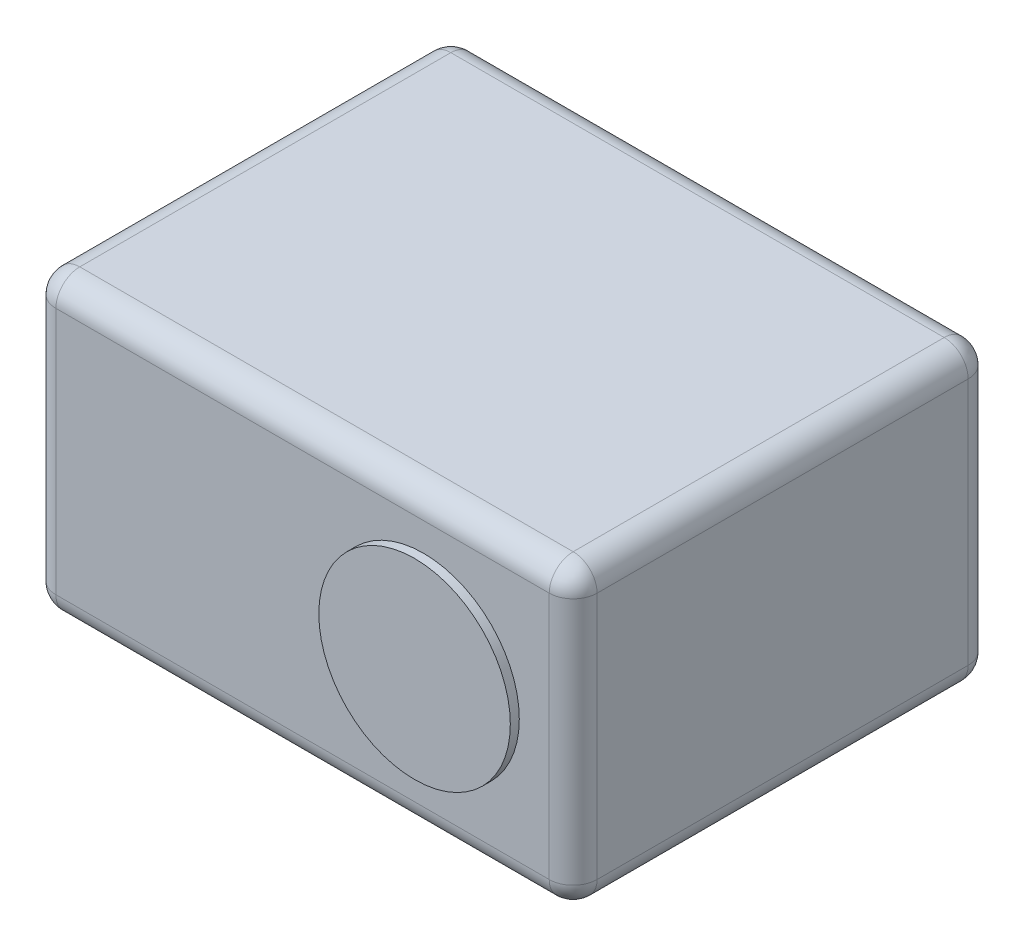
ISO-10303-21;
HEADER;
FILE_DESCRIPTION(('STEP AP214'),'2;1');
FILE_NAME('part.step','',(''),(''),'','','');
FILE_SCHEMA(('AUTOMOTIVE_DESIGN { 1 0 10303 214 1 1 1 1 }'));
ENDSEC;
DATA;
#1=APPLICATION_CONTEXT('core data for automotive mechanical design processes');
#2=APPLICATION_PROTOCOL_DEFINITION('international standard','automotive_design',2000,#1);
#3=PRODUCT_CONTEXT('',#1,'mechanical');
#4=PRODUCT('Part','Part','',(#3));
#5=PRODUCT_RELATED_PRODUCT_CATEGORY('part','',(#4));
#6=PRODUCT_DEFINITION_FORMATION('','',#4);
#7=PRODUCT_DEFINITION_CONTEXT('part definition',#1,'design');
#8=PRODUCT_DEFINITION('design','',#6,#7);
#9=PRODUCT_DEFINITION_SHAPE('','',#8);
#10=(LENGTH_UNIT() NAMED_UNIT(*) SI_UNIT(.MILLI.,.METRE.));
#11=(NAMED_UNIT(*) PLANE_ANGLE_UNIT() SI_UNIT($,.RADIAN.));
#12=(NAMED_UNIT(*) SI_UNIT($,.STERADIAN.) SOLID_ANGLE_UNIT());
#13=UNCERTAINTY_MEASURE_WITH_UNIT(LENGTH_MEASURE(1.E-05),#10,'distance_accuracy_value','');
#14=(GEOMETRIC_REPRESENTATION_CONTEXT(3) GLOBAL_UNCERTAINTY_ASSIGNED_CONTEXT((#13)) GLOBAL_UNIT_ASSIGNED_CONTEXT((#10,
#11,#12)) REPRESENTATION_CONTEXT('',''));
#15=CARTESIAN_POINT('',(0.,0.,0.));
#16=DIRECTION('',(0.,0.,1.));
#17=DIRECTION('',(1.,0.,0.));
#18=AXIS2_PLACEMENT_3D('',#15,#16,#17);
#19=CARTESIAN_POINT('',(0.,0.,18.25));
#20=DIRECTION('',(0.,0.,1.));
#21=DIRECTION('',(1.,0.,0.));
#22=AXIS2_PLACEMENT_3D('',#19,#20,#21);
#23=PLANE('',#22);
#24=CARTESIAN_POINT('',(0.,0.,18.25));
#25=DIRECTION('',(0.,0.,1.));
#26=DIRECTION('',(1.,0.,0.));
#27=AXIS2_PLACEMENT_3D('',#24,#25,#26);
#28=CIRCLE('',#27,8.);
#29=CARTESIAN_POINT('',(8.,0.,18.25));
#30=VERTEX_POINT('',#29);
#31=EDGE_CURVE('E379',#30,#30,#28,.T.);
#32=ORIENTED_EDGE('',*,*,#31,.T.);
#33=EDGE_LOOP('',(#32));
#34=FACE_BOUND('',#33,.T.);
#35=ADVANCED_FACE('F16',(#34),#23,.T.);
#36=CARTESIAN_POINT('',(10.5,10.36,15.5));
#37=DIRECTION('',(0.,-1.,0.));
#38=DIRECTION('',(1.,0.,0.));
#39=AXIS2_PLACEMENT_3D('',#36,#37,#38);
#40=SPHERICAL_SURFACE('',#39,2.);
#41=CARTESIAN_POINT('',(10.5,10.36,15.5));
#42=DIRECTION('',(0.,0.,-1.));
#43=DIRECTION('',(1.,0.,0.));
#44=AXIS2_PLACEMENT_3D('',#41,#42,#43);
#45=CIRCLE('',#44,2.);
#46=CARTESIAN_POINT('',(10.5,12.36,15.5));
#47=VERTEX_POINT('',#46);
#48=CARTESIAN_POINT('',(12.5,10.36,15.5));
#49=VERTEX_POINT('',#48);
#50=EDGE_CURVE('E10',#47,#49,#45,.T.);
#51=ORIENTED_EDGE('',*,*,#50,.F.);
#52=CARTESIAN_POINT('',(10.5,10.36,15.5));
#53=DIRECTION('',(1.,0.,0.));
#54=DIRECTION('',(0.,0.,1.));
#55=AXIS2_PLACEMENT_3D('',#52,#53,#54);
#56=CIRCLE('',#55,2.);
#57=CARTESIAN_POINT('',(10.5,10.36,17.5));
#58=VERTEX_POINT('',#57);
#59=EDGE_CURVE('E243',#47,#58,#56,.T.);
#60=ORIENTED_EDGE('',*,*,#59,.T.);
#61=CARTESIAN_POINT('',(10.5,10.36,15.5));
#62=DIRECTION('',(0.,-1.,0.));
#63=DIRECTION('',(1.,0.,0.));
#64=AXIS2_PLACEMENT_3D('',#61,#62,#63);
#65=CIRCLE('',#64,2.);
#66=EDGE_CURVE('E242',#49,#58,#65,.T.);
#67=ORIENTED_EDGE('',*,*,#66,.F.);
#68=EDGE_LOOP('',(#51,#60,#67));
#69=FACE_BOUND('',#68,.T.);
#70=ADVANCED_FACE('F523',(#69),#40,.T.);
#71=CARTESIAN_POINT('',(0.,0.,-18.25));
#72=DIRECTION('',(0.,0.,1.));
#73=DIRECTION('',(1.,0.,0.));
#74=AXIS2_PLACEMENT_3D('',#71,#72,#73);
#75=PLANE('',#74);
#76=CARTESIAN_POINT('',(0.,0.,-18.25));
#77=DIRECTION('',(0.,0.,1.));
#78=DIRECTION('',(1.,0.,0.));
#79=AXIS2_PLACEMENT_3D('',#76,#77,#78);
#80=CIRCLE('',#79,8.);
#81=CARTESIAN_POINT('',(8.,0.,-18.25));
#82=VERTEX_POINT('',#81);
#83=EDGE_CURVE('E370',#82,#82,#80,.T.);
#84=ORIENTED_EDGE('',*,*,#83,.F.);
#85=EDGE_LOOP('',(#84));
#86=FACE_BOUND('',#85,.T.);
#87=ADVANCED_FACE('F528',(#86),#75,.F.);
#88=CARTESIAN_POINT('',(8.3,9.5,0.));
#89=DIRECTION('',(0.,0.,1.));
#90=DIRECTION('',(1.,0.,0.));
#91=AXIS2_PLACEMENT_3D('',#88,#89,#90);
#92=PLANE('',#91);
#93=CARTESIAN_POINT('',(8.3,9.5,0.));
#94=DIRECTION('',(0.,0.,1.));
#95=DIRECTION('',(1.,0.,0.));
#96=AXIS2_PLACEMENT_3D('',#93,#94,#95);
#97=CIRCLE('',#96,1.1);
#98=CARTESIAN_POINT('',(9.4,9.5,0.));
#99=VERTEX_POINT('',#98);
#100=EDGE_CURVE('E357',#99,#99,#97,.T.);
#101=ORIENTED_EDGE('',*,*,#100,.F.);
#102=EDGE_LOOP('',(#101));
#103=FACE_BOUND('',#102,.T.);
#104=ADVANCED_FACE('F673',(#103),#92,.F.);
#105=CARTESIAN_POINT('',(8.3,-9.5,0.));
#106=DIRECTION('',(0.,0.,1.));
#107=DIRECTION('',(1.,0.,0.));
#108=AXIS2_PLACEMENT_3D('',#105,#106,#107);
#109=PLANE('',#108);
#110=CARTESIAN_POINT('',(8.3,-9.5,0.));
#111=DIRECTION('',(0.,0.,1.));
#112=DIRECTION('',(1.,0.,0.));
#113=AXIS2_PLACEMENT_3D('',#110,#111,#112);
#114=CIRCLE('',#113,1.1);
#115=CARTESIAN_POINT('',(9.4,-9.5,0.));
#116=VERTEX_POINT('',#115);
#117=EDGE_CURVE('E353',#116,#116,#114,.T.);
#118=ORIENTED_EDGE('',*,*,#117,.F.);
#119=EDGE_LOOP('',(#118));
#120=FACE_BOUND('',#119,.T.);
#121=ADVANCED_FACE('F668',(#120),#109,.F.);
#122=CARTESIAN_POINT('',(-28.5,9.5,0.));
#123=DIRECTION('',(0.,0.,1.));
#124=DIRECTION('',(1.,0.,0.));
#125=AXIS2_PLACEMENT_3D('',#122,#123,#124);
#126=PLANE('',#125);
#127=CARTESIAN_POINT('',(-28.5,9.5,0.));
#128=DIRECTION('',(0.,0.,1.));
#129=DIRECTION('',(1.,0.,0.));
#130=AXIS2_PLACEMENT_3D('',#127,#128,#129);
#131=CIRCLE('',#130,1.1);
#132=CARTESIAN_POINT('',(-27.4,9.5,0.));
#133=VERTEX_POINT('',#132);
#134=EDGE_CURVE('E348',#133,#133,#131,.T.);
#135=ORIENTED_EDGE('',*,*,#134,.F.);
#136=EDGE_LOOP('',(#135));
#137=FACE_BOUND('',#136,.T.);
#138=ADVANCED_FACE('F567',(#137),#126,.F.);
#139=CARTESIAN_POINT('',(-28.5,-9.5,0.));
#140=DIRECTION('',(0.,0.,1.));
#141=DIRECTION('',(1.,0.,0.));
#142=AXIS2_PLACEMENT_3D('',#139,#140,#141);
#143=PLANE('',#142);
#144=CARTESIAN_POINT('',(-28.5,-9.5,0.));
#145=DIRECTION('',(0.,0.,1.));
#146=DIRECTION('',(1.,0.,0.));
#147=AXIS2_PLACEMENT_3D('',#144,#145,#146);
#148=CIRCLE('',#147,1.1);
#149=CARTESIAN_POINT('',(-27.4,-9.5,0.));
#150=VERTEX_POINT('',#149);
#151=EDGE_CURVE('E344',#150,#150,#148,.T.);
#152=ORIENTED_EDGE('',*,*,#151,.F.);
#153=EDGE_LOOP('',(#152));
#154=FACE_BOUND('',#153,.T.);
#155=ADVANCED_FACE('F563',(#154),#143,.F.);
#156=CARTESIAN_POINT('',(10.5,10.36,-15.5));
#157=DIRECTION('',(0.,0.,1.));
#158=DIRECTION('',(1.,0.,0.));
#159=AXIS2_PLACEMENT_3D('',#156,#157,#158);
#160=SPHERICAL_SURFACE('',#159,2.);
#161=CARTESIAN_POINT('',(10.5,10.36,-15.5));
#162=DIRECTION('',(0.,-1.,0.));
#163=DIRECTION('',(1.,0.,0.));
#164=AXIS2_PLACEMENT_3D('',#161,#162,#163);
#165=CIRCLE('',#164,2.);
#166=CARTESIAN_POINT('',(10.5,10.36,-17.5));
#167=VERTEX_POINT('',#166);
#168=CARTESIAN_POINT('',(12.5,10.36,-15.5));
#169=VERTEX_POINT('',#168);
#170=EDGE_CURVE('E365',#167,#169,#165,.T.);
#171=ORIENTED_EDGE('',*,*,#170,.F.);
#172=CARTESIAN_POINT('',(10.5,10.36,-15.5));
#173=DIRECTION('',(1.,0.,0.));
#174=DIRECTION('',(0.,1.,0.));
#175=AXIS2_PLACEMENT_3D('',#172,#173,#174);
#176=CIRCLE('',#175,2.);
#177=CARTESIAN_POINT('',(10.5,12.36,-15.5));
#178=VERTEX_POINT('',#177);
#179=EDGE_CURVE('E340',#167,#178,#176,.T.);
#180=ORIENTED_EDGE('',*,*,#179,.T.);
#181=CARTESIAN_POINT('',(10.5,10.36,-15.5));
#182=DIRECTION('',(0.,0.,1.));
#183=DIRECTION('',(1.,0.,0.));
#184=AXIS2_PLACEMENT_3D('',#181,#182,#183);
#185=CIRCLE('',#184,2.);
#186=EDGE_CURVE('E27',#169,#178,#185,.T.);
#187=ORIENTED_EDGE('',*,*,#186,.F.);
#188=EDGE_LOOP('',(#171,#180,#187));
#189=FACE_BOUND('',#188,.T.);
#190=ADVANCED_FACE('F566',(#189),#160,.T.);
#191=CARTESIAN_POINT('',(12.5,-12.36,-17.5));
#192=DIRECTION('',(1.,0.,0.));
#193=DIRECTION('',(0.,1.,0.));
#194=AXIS2_PLACEMENT_3D('',#191,#192,#193);
#195=PLANE('',#194);
#196=DIRECTION('',(0.,0.,1.));
#197=VECTOR('',#196,1.);
#198=CARTESIAN_POINT('',(12.5,-10.36,-17.5));
#199=LINE('',#198,#197);
#200=CARTESIAN_POINT('',(12.5,-10.36,-15.5));
#201=VERTEX_POINT('',#200);
#202=CARTESIAN_POINT('',(12.5,-10.36,15.5));
#203=VERTEX_POINT('',#202);
#204=EDGE_CURVE('E251',#201,#203,#199,.T.);
#205=ORIENTED_EDGE('',*,*,#204,.F.);
#206=DIRECTION('',(0.,1.,0.));
#207=VECTOR('',#206,1.);
#208=CARTESIAN_POINT('',(12.5,-12.36,-15.5));
#209=LINE('',#208,#207);
#210=EDGE_CURVE('E366',#201,#169,#209,.T.);
#211=ORIENTED_EDGE('',*,*,#210,.T.);
#212=DIRECTION('',(0.,0.,1.));
#213=VECTOR('',#212,1.);
#214=CARTESIAN_POINT('',(12.5,10.36,-17.5));
#215=LINE('',#214,#213);
#216=EDGE_CURVE('E295',#169,#49,#215,.T.);
#217=ORIENTED_EDGE('',*,*,#216,.T.);
#218=DIRECTION('',(0.,1.,0.));
#219=VECTOR('',#218,1.);
#220=CARTESIAN_POINT('',(12.5,-12.36,15.5));
#221=LINE('',#220,#219);
#222=EDGE_CURVE('E238',#203,#49,#221,.T.);
#223=ORIENTED_EDGE('',*,*,#222,.F.);
#224=EDGE_LOOP('',(#205,#211,#217,#223));
#225=FACE_BOUND('',#224,.T.);
#226=ADVANCED_FACE('F837',(#225),#195,.T.);
#227=CARTESIAN_POINT('',(10.5,-10.36,15.5));
#228=DIRECTION('',(0.,0.,-1.));
#229=DIRECTION('',(1.,0.,0.));
#230=AXIS2_PLACEMENT_3D('',#227,#228,#229);
#231=SPHERICAL_SURFACE('',#230,2.);
#232=CARTESIAN_POINT('',(10.5,-10.36,15.5));
#233=DIRECTION('',(0.,1.,0.));
#234=DIRECTION('',(1.,0.,0.));
#235=AXIS2_PLACEMENT_3D('',#232,#233,#234);
#236=CIRCLE('',#235,2.);
#237=CARTESIAN_POINT('',(10.5,-10.36,17.5));
#238=VERTEX_POINT('',#237);
#239=EDGE_CURVE('E303',#238,#203,#236,.T.);
#240=ORIENTED_EDGE('',*,*,#239,.F.);
#241=CARTESIAN_POINT('',(10.5,-10.36,15.5));
#242=DIRECTION('',(1.,0.,0.));
#243=DIRECTION('',(0.,-1.,0.));
#244=AXIS2_PLACEMENT_3D('',#241,#242,#243);
#245=CIRCLE('',#244,2.);
#246=CARTESIAN_POINT('',(10.5,-12.36,15.5));
#247=VERTEX_POINT('',#246);
#248=EDGE_CURVE('E176',#238,#247,#245,.T.);
#249=ORIENTED_EDGE('',*,*,#248,.T.);
#250=CARTESIAN_POINT('',(10.5,-10.36,15.5));
#251=DIRECTION('',(0.,0.,-1.));
#252=DIRECTION('',(1.,0.,0.));
#253=AXIS2_PLACEMENT_3D('',#250,#251,#252);
#254=CIRCLE('',#253,2.);
#255=EDGE_CURVE('E252',#203,#247,#254,.T.);
#256=ORIENTED_EDGE('',*,*,#255,.F.);
#257=EDGE_LOOP('',(#240,#249,#256));
#258=FACE_BOUND('',#257,.T.);
#259=ADVANCED_FACE('F827',(#258),#231,.T.);
#260=CARTESIAN_POINT('',(10.5,-10.36,-15.5));
#261=DIRECTION('',(0.,0.,1.));
#262=DIRECTION('',(1.,0.,0.));
#263=AXIS2_PLACEMENT_3D('',#260,#261,#262);
#264=SPHERICAL_SURFACE('',#263,2.);
#265=CARTESIAN_POINT('',(10.5,-10.36,-15.5));
#266=DIRECTION('',(0.,0.,-1.));
#267=DIRECTION('',(1.,0.,0.));
#268=AXIS2_PLACEMENT_3D('',#265,#266,#267);
#269=CIRCLE('',#268,2.);
#270=CARTESIAN_POINT('',(10.5,-12.36,-15.5));
#271=VERTEX_POINT('',#270);
#272=EDGE_CURVE('E248',#201,#271,#269,.T.);
#273=ORIENTED_EDGE('',*,*,#272,.T.);
#274=CARTESIAN_POINT('',(10.5,-10.36,-15.5));
#275=DIRECTION('',(-1.,0.,0.));
#276=DIRECTION('',(0.,-1.,0.));
#277=AXIS2_PLACEMENT_3D('',#274,#275,#276);
#278=CIRCLE('',#277,2.);
#279=CARTESIAN_POINT('',(10.5,-10.36,-17.5));
#280=VERTEX_POINT('',#279);
#281=EDGE_CURVE('E328',#280,#271,#278,.T.);
#282=ORIENTED_EDGE('',*,*,#281,.F.);
#283=CARTESIAN_POINT('',(10.5,-10.36,-15.5));
#284=DIRECTION('',(0.,-1.,0.));
#285=DIRECTION('',(1.,0.,0.));
#286=AXIS2_PLACEMENT_3D('',#283,#284,#285);
#287=CIRCLE('',#286,2.);
#288=EDGE_CURVE('E361',#280,#201,#287,.T.);
#289=ORIENTED_EDGE('',*,*,#288,.T.);
#290=EDGE_LOOP('',(#273,#282,#289));
#291=FACE_BOUND('',#290,.T.);
#292=ADVANCED_FACE('F817',(#291),#264,.T.);
#293=CARTESIAN_POINT('',(10.5,10.36,-17.5));
#294=DIRECTION('',(0.,0.,1.));
#295=DIRECTION('',(1.,0.,0.));
#296=AXIS2_PLACEMENT_3D('',#293,#294,#295);
#297=CYLINDRICAL_SURFACE('',#296,2.);
#298=ORIENTED_EDGE('',*,*,#216,.F.);
#299=ORIENTED_EDGE('',*,*,#186,.T.);
#300=DIRECTION('',(0.,0.,1.));
#301=VECTOR('',#300,1.);
#302=CARTESIAN_POINT('',(10.5,12.36,-17.5));
#303=LINE('',#302,#301);
#304=EDGE_CURVE('E324',#178,#47,#303,.T.);
#305=ORIENTED_EDGE('',*,*,#304,.T.);
#306=ORIENTED_EDGE('',*,*,#50,.T.);
#307=EDGE_LOOP('',(#298,#299,#305,#306));
#308=FACE_BOUND('',#307,.T.);
#309=ADVANCED_FACE('F536',(#308),#297,.T.);
#310=CARTESIAN_POINT('',(0.,0.,16.75));
#311=DIRECTION('',(0.,0.,1.));
#312=DIRECTION('',(1.,0.,0.));
#313=AXIS2_PLACEMENT_3D('',#310,#311,#312);
#314=CYLINDRICAL_SURFACE('',#313,8.);
#315=ORIENTED_EDGE('',*,*,#31,.F.);
#316=EDGE_LOOP('',(#315));
#317=FACE_BOUND('',#316,.T.);
#318=CARTESIAN_POINT('',(0.,0.,17.5));
#319=DIRECTION('',(0.,0.,1.));
#320=DIRECTION('',(1.,0.,0.));
#321=AXIS2_PLACEMENT_3D('',#318,#319,#320);
#322=CIRCLE('',#321,8.);
#323=CARTESIAN_POINT('',(8.,0.,17.5));
#324=VERTEX_POINT('',#323);
#325=EDGE_CURVE('E296',#324,#324,#322,.T.);
#326=ORIENTED_EDGE('',*,*,#325,.T.);
#327=EDGE_LOOP('',(#326));
#328=FACE_BOUND('',#327,.T.);
#329=ADVANCED_FACE('F532',(#317,#328),#314,.T.);
#330=CARTESIAN_POINT('',(10.5,-12.36,15.5));
#331=DIRECTION('',(0.,1.,0.));
#332=DIRECTION('',(1.,0.,0.));
#333=AXIS2_PLACEMENT_3D('',#330,#331,#332);
#334=CYLINDRICAL_SURFACE('',#333,2.);
#335=ORIENTED_EDGE('',*,*,#222,.T.);
#336=ORIENTED_EDGE('',*,*,#66,.T.);
#337=DIRECTION('',(0.,1.,0.));
#338=VECTOR('',#337,1.);
#339=CARTESIAN_POINT('',(10.5,-12.36,17.5));
#340=LINE('',#339,#338);
#341=EDGE_CURVE('E182',#238,#58,#340,.T.);
#342=ORIENTED_EDGE('',*,*,#341,.F.);
#343=ORIENTED_EDGE('',*,*,#239,.T.);
#344=EDGE_LOOP('',(#335,#336,#342,#343));
#345=FACE_BOUND('',#344,.T.);
#346=ADVANCED_FACE('F535',(#345),#334,.T.);
#347=CARTESIAN_POINT('',(-32.72,10.36,15.5));
#348=DIRECTION('',(1.,0.,0.));
#349=DIRECTION('',(0.,1.,0.));
#350=AXIS2_PLACEMENT_3D('',#347,#348,#349);
#351=CYLINDRICAL_SURFACE('',#350,2.);
#352=CARTESIAN_POINT('',(-30.72,10.36,15.5));
#353=DIRECTION('',(1.,0.,0.));
#354=DIRECTION('',(0.,0.,1.));
#355=AXIS2_PLACEMENT_3D('',#352,#353,#354);
#356=CIRCLE('',#355,2.);
#357=CARTESIAN_POINT('',(-30.72,12.36,15.5));
#358=VERTEX_POINT('',#357);
#359=CARTESIAN_POINT('',(-30.72,10.36,17.5));
#360=VERTEX_POINT('',#359);
#361=EDGE_CURVE('E300',#358,#360,#356,.T.);
#362=ORIENTED_EDGE('',*,*,#361,.T.);
#363=DIRECTION('',(1.,0.,0.));
#364=VECTOR('',#363,1.);
#365=CARTESIAN_POINT('',(-32.72,10.36,17.5));
#366=LINE('',#365,#364);
#367=EDGE_CURVE('E201',#360,#58,#366,.T.);
#368=ORIENTED_EDGE('',*,*,#367,.T.);
#369=ORIENTED_EDGE('',*,*,#59,.F.);
#370=DIRECTION('',(1.,0.,0.));
#371=VECTOR('',#370,1.);
#372=CARTESIAN_POINT('',(-32.72,12.36,15.5));
#373=LINE('',#372,#371);
#374=EDGE_CURVE('E320',#358,#47,#373,.T.);
#375=ORIENTED_EDGE('',*,*,#374,.F.);
#376=EDGE_LOOP('',(#362,#368,#369,#375));
#377=FACE_BOUND('',#376,.T.);
#378=ADVANCED_FACE('F779',(#377),#351,.T.);
#379=CARTESIAN_POINT('',(0.,0.,-18.25));
#380=DIRECTION('',(0.,0.,1.));
#381=DIRECTION('',(1.,0.,0.));
#382=AXIS2_PLACEMENT_3D('',#379,#380,#381);
#383=CYLINDRICAL_SURFACE('',#382,8.);
#384=CARTESIAN_POINT('',(0.,0.,-17.5));
#385=DIRECTION('',(0.,0.,1.));
#386=DIRECTION('',(1.,0.,0.));
#387=AXIS2_PLACEMENT_3D('',#384,#385,#386);
#388=CIRCLE('',#387,8.);
#389=CARTESIAN_POINT('',(8.,0.,-17.5));
#390=VERTEX_POINT('',#389);
#391=EDGE_CURVE('E307',#390,#390,#388,.T.);
#392=ORIENTED_EDGE('',*,*,#391,.F.);
#393=EDGE_LOOP('',(#392));
#394=FACE_BOUND('',#393,.T.);
#395=ORIENTED_EDGE('',*,*,#83,.T.);
#396=EDGE_LOOP('',(#395));
#397=FACE_BOUND('',#396,.T.);
#398=ADVANCED_FACE('F769',(#394,#397),#383,.T.);
#399=CARTESIAN_POINT('',(10.5,-12.36,-15.5));
#400=DIRECTION('',(0.,1.,0.));
#401=DIRECTION('',(1.,0.,0.));
#402=AXIS2_PLACEMENT_3D('',#399,#400,#401);
#403=CYLINDRICAL_SURFACE('',#402,2.);
#404=ORIENTED_EDGE('',*,*,#288,.F.);
#405=DIRECTION('',(0.,1.,0.));
#406=VECTOR('',#405,1.);
#407=CARTESIAN_POINT('',(10.5,-12.36,-17.5));
#408=LINE('',#407,#406);
#409=EDGE_CURVE('E274',#280,#167,#408,.T.);
#410=ORIENTED_EDGE('',*,*,#409,.T.);
#411=ORIENTED_EDGE('',*,*,#170,.T.);
#412=ORIENTED_EDGE('',*,*,#210,.F.);
#413=EDGE_LOOP('',(#404,#410,#411,#412));
#414=FACE_BOUND('',#413,.T.);
#415=ADVANCED_FACE('F493',(#414),#403,.T.);
#416=CARTESIAN_POINT('',(8.3,9.5,-40.));
#417=DIRECTION('',(0.,0.,1.));
#418=DIRECTION('',(1.,0.,0.));
#419=AXIS2_PLACEMENT_3D('',#416,#417,#418);
#420=CYLINDRICAL_SURFACE('',#419,1.1);
#421=ORIENTED_EDGE('',*,*,#100,.T.);
#422=EDGE_LOOP('',(#421));
#423=FACE_BOUND('',#422,.T.);
#424=CARTESIAN_POINT('',(8.3,9.5,-17.5));
#425=DIRECTION('',(0.,0.,1.));
#426=DIRECTION('',(1.,0.,0.));
#427=AXIS2_PLACEMENT_3D('',#424,#425,#426);
#428=CIRCLE('',#427,1.1);
#429=CARTESIAN_POINT('',(7.614142872021,10.36,-17.5));
#430=VERTEX_POINT('',#429);
#431=CARTESIAN_POINT('',(8.985857127979,10.36,-17.5));
#432=VERTEX_POINT('',#431);
#433=EDGE_CURVE('E270',#430,#432,#428,.T.);
#434=ORIENTED_EDGE('',*,*,#433,.F.);
#435=CARTESIAN_POINT('',(8.985857127979,10.36,-17.5));
#436=CARTESIAN_POINT('',(8.962580050775,10.378563661999,-17.5));
#437=CARTESIAN_POINT('',(8.93880921,10.396284056714,-17.49979318414));
#438=CARTESIAN_POINT('',(8.914582354688,10.413153345884,-17.49941492579));
#439=CARTESIAN_POINT('',(8.889935191765,10.429165703606,-17.49889809744));
#440=CARTESIAN_POINT('',(8.864901386057,10.444317316334,-17.4982730707));
#441=CARTESIAN_POINT('',(8.755804995784,10.505717776298,-17.49524214604));
#442=CARTESIAN_POINT('',(8.668260347373,10.543438901577,-17.49204362977));
#443=CARTESIAN_POINT('',(8.577972216659,10.571723165599,-17.48896590311));
#444=CARTESIAN_POINT('',(8.485905883758,10.590573722656,-17.4866871119));
#445=CARTESIAN_POINT('',(8.392955739492,10.6,-17.48554778335));
#446=CARTESIAN_POINT('',(8.228579617998,10.6,-17.48554778335));
#447=CARTESIAN_POINT('',(8.157165496063,10.594435646928,-17.48622027862));
#448=CARTESIAN_POINT('',(8.086150944816,10.583307648799,-17.48756562105));
#449=CARTESIAN_POINT('',(8.015942391231,10.566613222053,-17.48946455602));
#450=CARTESIAN_POINT('',(7.946966144322,10.54435116726,-17.49168110041));
#451=CARTESIAN_POINT('',(7.859123512565,10.508029021298,-17.49453254388));
#452=CARTESIAN_POINT('',(7.838729390949,10.499012397554,-17.49519666234));
#453=CARTESIAN_POINT('',(7.818505923219,10.48947726982,-17.49584780193));
#454=CARTESIAN_POINT('',(7.798466752414,10.479424102199,-17.49647501358));
#455=CARTESIAN_POINT('',(7.778626037381,10.468853626689,-17.49706637324));
#456=CARTESIAN_POINT('',(7.733875090767,10.443575729955,-17.49830352235));
#457=CARTESIAN_POINT('',(7.709101058442,10.42853894146,-17.49891823153));
#458=CARTESIAN_POINT('',(7.684707112971,10.412658267707,-17.49942597355));
#459=CARTESIAN_POINT('',(7.660725978369,10.395937443039,-17.49979721002));
#460=CARTESIAN_POINT('',(7.637192345489,10.378382146133,-17.5));
#461=CARTESIAN_POINT('',(7.614142872021,10.36,-17.5));
#462=B_SPLINE_CURVE_WITH_KNOTS('',6,(#435,#436,#437,#438,#439,#440,#441,#442,#443,#444,#445,
#446,#447,#448,#449,#450,#451,#452,#453,#454,#455,#456,#457,#458,#459,#460,#461),.UNSPECIFIED.,
.F.,.F.,(7,5,5,5,5,7),(0.,0.116357629148,0.499991509364,0.794747684975,0.884770522121,1.),.UNSPECIFIED.);
#463=EDGE_CURVE('E342',#432,#430,#462,.T.);
#464=ORIENTED_EDGE('',*,*,#463,.F.);
#465=EDGE_LOOP('',(#434,#464));
#466=FACE_BOUND('',#465,.T.);
#467=ADVANCED_FACE('F491',(#423,#466),#420,.F.);
#468=CARTESIAN_POINT('',(8.3,-9.5,-40.));
#469=DIRECTION('',(0.,0.,1.));
#470=DIRECTION('',(1.,0.,0.));
#471=AXIS2_PLACEMENT_3D('',#468,#469,#470);
#472=CYLINDRICAL_SURFACE('',#471,1.1);
#473=ORIENTED_EDGE('',*,*,#117,.T.);
#474=EDGE_LOOP('',(#473));
#475=FACE_BOUND('',#474,.T.);
#476=CARTESIAN_POINT('',(8.3,-9.5,-17.5));
#477=DIRECTION('',(0.,0.,1.));
#478=DIRECTION('',(1.,0.,0.));
#479=AXIS2_PLACEMENT_3D('',#476,#477,#478);
#480=CIRCLE('',#479,1.1);
#481=CARTESIAN_POINT('',(8.985857127979,-10.36,-17.5));
#482=VERTEX_POINT('',#481);
#483=CARTESIAN_POINT('',(7.614142872021,-10.36,-17.5));
#484=VERTEX_POINT('',#483);
#485=EDGE_CURVE('E282',#482,#484,#480,.T.);
#486=ORIENTED_EDGE('',*,*,#485,.F.);
#487=CARTESIAN_POINT('',(7.614142872021,-10.36,-17.5));
#488=CARTESIAN_POINT('',(7.637419949225,-10.37856366199,-17.5));
#489=CARTESIAN_POINT('',(7.66119079,-10.39628405671,-17.49979318414));
#490=CARTESIAN_POINT('',(7.685417645312,-10.41315334588,-17.49941492579));
#491=CARTESIAN_POINT('',(7.710064808235,-10.4291657036,-17.49889809744));
#492=CARTESIAN_POINT('',(7.735098613943,-10.44431731633,-17.4982730707));
#493=CARTESIAN_POINT('',(7.844195004216,-10.50571777629,-17.49524214604));
#494=CARTESIAN_POINT('',(7.931739652626,-10.54343890157,-17.49204362977));
#495=CARTESIAN_POINT('',(8.022027783342,-10.57172316559,-17.48896590311));
#496=CARTESIAN_POINT('',(8.114094116242,-10.59057372265,-17.4866871119));
#497=CARTESIAN_POINT('',(8.207044260508,-10.6,-17.48554778335));
#498=CARTESIAN_POINT('',(8.371420382001,-10.6,-17.48554778335));
#499=CARTESIAN_POINT('',(8.442834503937,-10.59443564692,-17.48622027862));
#500=CARTESIAN_POINT('',(8.513849055184,-10.58330764879,-17.48756562105));
#501=CARTESIAN_POINT('',(8.584057608769,-10.56661322205,-17.48946455602));
#502=CARTESIAN_POINT('',(8.653033855678,-10.54435116726,-17.49168110041));
#503=CARTESIAN_POINT('',(8.740876487435,-10.50802902129,-17.49453254388));
#504=CARTESIAN_POINT('',(8.761270609051,-10.49901239755,-17.49519666234));
#505=CARTESIAN_POINT('',(8.781494076781,-10.48947726982,-17.49584780193));
#506=CARTESIAN_POINT('',(8.801533247586,-10.47942410219,-17.49647501358));
#507=CARTESIAN_POINT('',(8.821373962619,-10.46885362668,-17.49706637324));
#508=CARTESIAN_POINT('',(8.866124909233,-10.44357572995,-17.49830352235));
#509=CARTESIAN_POINT('',(8.890898941558,-10.42853894146,-17.49891823153));
#510=CARTESIAN_POINT('',(8.915292887029,-10.4126582677,-17.49942597355));
#511=CARTESIAN_POINT('',(8.939274021631,-10.39593744303,-17.49979721002));
#512=CARTESIAN_POINT('',(8.962807654511,-10.37838214613,-17.5));
#513=CARTESIAN_POINT('',(8.985857127979,-10.36,-17.5));
#514=B_SPLINE_CURVE_WITH_KNOTS('',6,(#487,#488,#489,#490,#491,#492,#493,#494,#495,#496,#497,
#498,#499,#500,#501,#502,#503,#504,#505,#506,#507,#508,#509,#510,#511,#512,#513),.UNSPECIFIED.,
.F.,.F.,(7,5,5,5,5,7),(0.,0.116357629148,0.499991509364,0.794747684975,0.884770522121,1.),.UNSPECIFIED.);
#515=EDGE_CURVE('E332',#484,#482,#514,.T.);
#516=ORIENTED_EDGE('',*,*,#515,.F.);
#517=EDGE_LOOP('',(#486,#516));
#518=FACE_BOUND('',#517,.T.);
#519=ADVANCED_FACE('F738',(#475,#518),#472,.F.);
#520=CARTESIAN_POINT('',(-28.5,9.5,-40.));
#521=DIRECTION('',(0.,0.,1.));
#522=DIRECTION('',(1.,0.,0.));
#523=AXIS2_PLACEMENT_3D('',#520,#521,#522);
#524=CYLINDRICAL_SURFACE('',#523,1.1);
#525=ORIENTED_EDGE('',*,*,#134,.T.);
#526=EDGE_LOOP('',(#525));
#527=FACE_BOUND('',#526,.T.);
#528=CARTESIAN_POINT('',(-28.5,9.5,-17.5));
#529=DIRECTION('',(0.,0.,1.));
#530=DIRECTION('',(1.,0.,0.));
#531=AXIS2_PLACEMENT_3D('',#528,#529,#530);
#532=CIRCLE('',#531,1.1);
#533=CARTESIAN_POINT('',(-29.18585712797,10.36,-17.5));
#534=VERTEX_POINT('',#533);
#535=CARTESIAN_POINT('',(-27.81414287202,10.36,-17.5));
#536=VERTEX_POINT('',#535);
#537=EDGE_CURVE('E263',#534,#536,#532,.T.);
#538=ORIENTED_EDGE('',*,*,#537,.F.);
#539=CARTESIAN_POINT('',(-27.81414287202,10.36,-17.5));
#540=CARTESIAN_POINT('',(-27.83741994922,10.378563661999,-17.5));
#541=CARTESIAN_POINT('',(-27.86119079,10.396284056714,-17.49979318414));
#542=CARTESIAN_POINT('',(-27.88541764531,10.413153345884,-17.49941492579));
#543=CARTESIAN_POINT('',(-27.91006480823,10.429165703606,-17.49889809744));
#544=CARTESIAN_POINT('',(-27.93509861394,10.444317316334,-17.4982730707));
#545=CARTESIAN_POINT('',(-28.04419500421,10.505717776298,-17.49524214604));
#546=CARTESIAN_POINT('',(-28.13173965262,10.543438901577,-17.49204362977));
#547=CARTESIAN_POINT('',(-28.22202778334,10.571723165599,-17.48896590311));
#548=CARTESIAN_POINT('',(-28.31409411624,10.590573722656,-17.4866871119));
#549=CARTESIAN_POINT('',(-28.4070442605,10.6,-17.48554778335));
#550=CARTESIAN_POINT('',(-28.571420382,10.6,-17.48554778335));
#551=CARTESIAN_POINT('',(-28.64283450393,10.594435646928,-17.48622027862));
#552=CARTESIAN_POINT('',(-28.71384905518,10.583307648799,-17.48756562105));
#553=CARTESIAN_POINT('',(-28.78405760876,10.566613222053,-17.48946455602));
#554=CARTESIAN_POINT('',(-28.85303385567,10.54435116726,-17.49168110041));
#555=CARTESIAN_POINT('',(-28.94087648743,10.508029021298,-17.49453254388));
#556=CARTESIAN_POINT('',(-28.96127060905,10.499012397554,-17.49519666234));
#557=CARTESIAN_POINT('',(-28.98149407678,10.48947726982,-17.49584780193));
#558=CARTESIAN_POINT('',(-29.00153324758,10.479424102199,-17.49647501358));
#559=CARTESIAN_POINT('',(-29.02137396262,10.468853626689,-17.49706637324));
#560=CARTESIAN_POINT('',(-29.06612490923,10.443575729955,-17.49830352235));
#561=CARTESIAN_POINT('',(-29.09089894155,10.42853894146,-17.49891823153));
#562=CARTESIAN_POINT('',(-29.11529288702,10.412658267707,-17.49942597355));
#563=CARTESIAN_POINT('',(-29.13927402163,10.395937443039,-17.49979721002));
#564=CARTESIAN_POINT('',(-29.16280765451,10.378382146133,-17.5));
#565=CARTESIAN_POINT('',(-29.18585712797,10.36,-17.5));
#566=B_SPLINE_CURVE_WITH_KNOTS('',6,(#539,#540,#541,#542,#543,#544,#545,#546,#547,#548,#549,
#550,#551,#552,#553,#554,#555,#556,#557,#558,#559,#560,#561,#562,#563,#564,#565),.UNSPECIFIED.,
.F.,.F.,(7,5,5,5,5,7),(0.,0.116357629148,0.499991509364,0.794747684975,0.884770522121,1.),.UNSPECIFIED.);
#567=EDGE_CURVE('E349',#536,#534,#566,.T.);
#568=ORIENTED_EDGE('',*,*,#567,.F.);
#569=EDGE_LOOP('',(#538,#568));
#570=FACE_BOUND('',#569,.T.);
#571=ADVANCED_FACE('F485',(#527,#570),#524,.F.);
#572=CARTESIAN_POINT('',(-28.5,-9.5,-40.));
#573=DIRECTION('',(0.,0.,1.));
#574=DIRECTION('',(1.,0.,0.));
#575=AXIS2_PLACEMENT_3D('',#572,#573,#574);
#576=CYLINDRICAL_SURFACE('',#575,1.1);
#577=ORIENTED_EDGE('',*,*,#151,.T.);
#578=EDGE_LOOP('',(#577));
#579=FACE_BOUND('',#578,.T.);
#580=CARTESIAN_POINT('',(-28.5,-9.5,-17.5));
#581=DIRECTION('',(0.,0.,1.));
#582=DIRECTION('',(1.,0.,0.));
#583=AXIS2_PLACEMENT_3D('',#580,#581,#582);
#584=CIRCLE('',#583,1.1);
#585=CARTESIAN_POINT('',(-27.81414287202,-10.36,-17.5));
#586=VERTEX_POINT('',#585);
#587=CARTESIAN_POINT('',(-29.18585712797,-10.36,-17.5));
#588=VERTEX_POINT('',#587);
#589=EDGE_CURVE('E289',#586,#588,#584,.T.);
#590=ORIENTED_EDGE('',*,*,#589,.F.);
#591=CARTESIAN_POINT('',(-29.18585712797,-10.36,-17.5));
#592=CARTESIAN_POINT('',(-29.16258005077,-10.37856366199,-17.5));
#593=CARTESIAN_POINT('',(-29.13880921,-10.39628405671,-17.49979318414));
#594=CARTESIAN_POINT('',(-29.11458235468,-10.41315334588,-17.49941492579));
#595=CARTESIAN_POINT('',(-29.08993519176,-10.4291657036,-17.49889809744));
#596=CARTESIAN_POINT('',(-29.06490138605,-10.44431731633,-17.4982730707));
#597=CARTESIAN_POINT('',(-28.95580499578,-10.50571777629,-17.49524214604));
#598=CARTESIAN_POINT('',(-28.86826034737,-10.54343890157,-17.49204362977));
#599=CARTESIAN_POINT('',(-28.77797221665,-10.57172316559,-17.48896590311));
#600=CARTESIAN_POINT('',(-28.68590588375,-10.59057372265,-17.4866871119));
#601=CARTESIAN_POINT('',(-28.59295573949,-10.6,-17.48554778335));
#602=CARTESIAN_POINT('',(-28.42857961799,-10.6,-17.48554778335));
#603=CARTESIAN_POINT('',(-28.35716549606,-10.59443564692,-17.48622027862));
#604=CARTESIAN_POINT('',(-28.28615094481,-10.58330764879,-17.48756562105));
#605=CARTESIAN_POINT('',(-28.21594239123,-10.56661322205,-17.48946455602));
#606=CARTESIAN_POINT('',(-28.14696614432,-10.54435116726,-17.49168110041));
#607=CARTESIAN_POINT('',(-28.05912351256,-10.50802902129,-17.49453254388));
#608=CARTESIAN_POINT('',(-28.03872939094,-10.49901239755,-17.49519666234));
#609=CARTESIAN_POINT('',(-28.01850592321,-10.48947726982,-17.49584780193));
#610=CARTESIAN_POINT('',(-27.99846675241,-10.47942410219,-17.49647501358));
#611=CARTESIAN_POINT('',(-27.97862603738,-10.46885362668,-17.49706637324));
#612=CARTESIAN_POINT('',(-27.93387509076,-10.44357572995,-17.49830352235));
#613=CARTESIAN_POINT('',(-27.90910105844,-10.42853894146,-17.49891823153));
#614=CARTESIAN_POINT('',(-27.88470711297,-10.4126582677,-17.49942597355));
#615=CARTESIAN_POINT('',(-27.86072597836,-10.39593744303,-17.49979721002));
#616=CARTESIAN_POINT('',(-27.83719234548,-10.37838214613,-17.5));
#617=CARTESIAN_POINT('',(-27.81414287202,-10.36,-17.5));
#618=B_SPLINE_CURVE_WITH_KNOTS('',6,(#591,#592,#593,#594,#595,#596,#597,#598,#599,#600,#601,
#602,#603,#604,#605,#606,#607,#608,#609,#610,#611,#612,#613,#614,#615,#616,#617),.UNSPECIFIED.,
.F.,.F.,(7,5,5,5,5,7),(0.,0.116357629148,0.499991509364,0.794747684975,0.884770522121,1.),.UNSPECIFIED.);
#619=EDGE_CURVE('E19',#588,#586,#618,.T.);
#620=ORIENTED_EDGE('',*,*,#619,.F.);
#621=EDGE_LOOP('',(#590,#620));
#622=FACE_BOUND('',#621,.T.);
#623=ADVANCED_FACE('F718',(#579,#622),#576,.F.);
#624=CARTESIAN_POINT('',(-32.72,10.36,-15.5));
#625=DIRECTION('',(1.,0.,0.));
#626=DIRECTION('',(0.,1.,0.));
#627=AXIS2_PLACEMENT_3D('',#624,#625,#626);
#628=CYLINDRICAL_SURFACE('',#627,2.);
#629=DIRECTION('',(1.,0.,0.));
#630=VECTOR('',#629,1.);
#631=CARTESIAN_POINT('',(-32.72,12.36,-15.5));
#632=LINE('',#631,#630);
#633=CARTESIAN_POINT('',(-30.72,12.36,-15.5));
#634=VERTEX_POINT('',#633);
#635=EDGE_CURVE('E327',#634,#178,#632,.T.);
#636=ORIENTED_EDGE('',*,*,#635,.T.);
#637=ORIENTED_EDGE('',*,*,#179,.F.);
#638=DIRECTION('',(1.,0.,0.));
#639=VECTOR('',#638,1.);
#640=CARTESIAN_POINT('',(-32.72,10.36,-17.5));
#641=LINE('',#640,#639);
#642=EDGE_CURVE('E273',#432,#167,#641,.T.);
#643=ORIENTED_EDGE('',*,*,#642,.F.);
#644=ORIENTED_EDGE('',*,*,#463,.T.);
#645=DIRECTION('',(1.,0.,0.));
#646=VECTOR('',#645,1.);
#647=CARTESIAN_POINT('',(-32.72,10.36,-17.5));
#648=LINE('',#647,#646);
#649=EDGE_CURVE('E266',#536,#430,#648,.T.);
#650=ORIENTED_EDGE('',*,*,#649,.F.);
#651=ORIENTED_EDGE('',*,*,#567,.T.);
#652=DIRECTION('',(1.,0.,0.));
#653=VECTOR('',#652,1.);
#654=CARTESIAN_POINT('',(-32.72,10.36,-17.5));
#655=LINE('',#654,#653);
#656=CARTESIAN_POINT('',(-30.72,10.36,-17.5));
#657=VERTEX_POINT('',#656);
#658=EDGE_CURVE('E259',#657,#534,#655,.T.);
#659=ORIENTED_EDGE('',*,*,#658,.F.);
#660=CARTESIAN_POINT('',(-30.72,10.36,-15.5));
#661=DIRECTION('',(1.,0.,0.));
#662=DIRECTION('',(0.,1.,0.));
#663=AXIS2_PLACEMENT_3D('',#660,#661,#662);
#664=CIRCLE('',#663,2.);
#665=EDGE_CURVE('E183',#657,#634,#664,.T.);
#666=ORIENTED_EDGE('',*,*,#665,.T.);
#667=EDGE_LOOP('',(#636,#637,#643,#644,#650,#651,#659,#666));
#668=FACE_BOUND('',#667,.T.);
#669=ADVANCED_FACE('F480',(#668),#628,.T.);
#670=CARTESIAN_POINT('',(10.5,-10.36,-17.5));
#671=DIRECTION('',(0.,0.,1.));
#672=DIRECTION('',(1.,0.,0.));
#673=AXIS2_PLACEMENT_3D('',#670,#671,#672);
#674=CYLINDRICAL_SURFACE('',#673,2.);
#675=ORIENTED_EDGE('',*,*,#255,.T.);
#676=DIRECTION('',(0.,0.,1.));
#677=VECTOR('',#676,1.);
#678=CARTESIAN_POINT('',(10.5,-12.36,-17.5));
#679=LINE('',#678,#677);
#680=EDGE_CURVE('E247',#271,#247,#679,.T.);
#681=ORIENTED_EDGE('',*,*,#680,.F.);
#682=ORIENTED_EDGE('',*,*,#272,.F.);
#683=ORIENTED_EDGE('',*,*,#204,.T.);
#684=EDGE_LOOP('',(#675,#681,#682,#683));
#685=FACE_BOUND('',#684,.T.);
#686=ADVANCED_FACE('F502',(#685),#674,.T.);
#687=CARTESIAN_POINT('',(-32.72,-10.36,15.5));
#688=DIRECTION('',(1.,0.,0.));
#689=DIRECTION('',(0.,-1.,0.));
#690=AXIS2_PLACEMENT_3D('',#687,#688,#689);
#691=CYLINDRICAL_SURFACE('',#690,2.);
#692=DIRECTION('',(1.,0.,0.));
#693=VECTOR('',#692,1.);
#694=CARTESIAN_POINT('',(-32.72,-12.36,15.5));
#695=LINE('',#694,#693);
#696=CARTESIAN_POINT('',(-30.72,-12.36,15.5));
#697=VERTEX_POINT('',#696);
#698=EDGE_CURVE('E256',#697,#247,#695,.T.);
#699=ORIENTED_EDGE('',*,*,#698,.T.);
#700=ORIENTED_EDGE('',*,*,#248,.F.);
#701=DIRECTION('',(1.,0.,0.));
#702=VECTOR('',#701,1.);
#703=CARTESIAN_POINT('',(-32.72,-10.36,17.5));
#704=LINE('',#703,#702);
#705=CARTESIAN_POINT('',(-30.72,-10.36,17.5));
#706=VERTEX_POINT('',#705);
#707=EDGE_CURVE('E169',#706,#238,#704,.T.);
#708=ORIENTED_EDGE('',*,*,#707,.F.);
#709=CARTESIAN_POINT('',(-30.72,-10.36,15.5));
#710=DIRECTION('',(1.,0.,0.));
#711=DIRECTION('',(0.,-1.,0.));
#712=AXIS2_PLACEMENT_3D('',#709,#710,#711);
#713=CIRCLE('',#712,2.);
#714=EDGE_CURVE('E173',#706,#697,#713,.T.);
#715=ORIENTED_EDGE('',*,*,#714,.T.);
#716=EDGE_LOOP('',(#699,#700,#708,#715));
#717=FACE_BOUND('',#716,.T.);
#718=ADVANCED_FACE('F172',(#717),#691,.T.);
#719=CARTESIAN_POINT('',(-32.72,-10.36,-15.5));
#720=DIRECTION('',(1.,0.,0.));
#721=DIRECTION('',(0.,-1.,0.));
#722=AXIS2_PLACEMENT_3D('',#719,#720,#721);
#723=CYLINDRICAL_SURFACE('',#722,2.);
#724=CARTESIAN_POINT('',(-30.72,-10.36,-15.5));
#725=DIRECTION('',(-1.,0.,0.));
#726=DIRECTION('',(0.,-1.,0.));
#727=AXIS2_PLACEMENT_3D('',#724,#725,#726);
#728=CIRCLE('',#727,2.);
#729=CARTESIAN_POINT('',(-30.72,-10.36,-17.5));
#730=VERTEX_POINT('',#729);
#731=CARTESIAN_POINT('',(-30.72,-12.36,-15.5));
#732=VERTEX_POINT('',#731);
#733=EDGE_CURVE('E194',#730,#732,#728,.T.);
#734=ORIENTED_EDGE('',*,*,#733,.F.);
#735=DIRECTION('',(1.,0.,0.));
#736=VECTOR('',#735,1.);
#737=CARTESIAN_POINT('',(-32.72,-10.36,-17.5));
#738=LINE('',#737,#736);
#739=EDGE_CURVE('E292',#730,#588,#738,.T.);
#740=ORIENTED_EDGE('',*,*,#739,.T.);
#741=ORIENTED_EDGE('',*,*,#619,.T.);
#742=DIRECTION('',(1.,0.,0.));
#743=VECTOR('',#742,1.);
#744=CARTESIAN_POINT('',(-32.72,-10.36,-17.5));
#745=LINE('',#744,#743);
#746=EDGE_CURVE('E285',#586,#484,#745,.T.);
#747=ORIENTED_EDGE('',*,*,#746,.T.);
#748=ORIENTED_EDGE('',*,*,#515,.T.);
#749=DIRECTION('',(1.,0.,0.));
#750=VECTOR('',#749,1.);
#751=CARTESIAN_POINT('',(-32.72,-10.36,-17.5));
#752=LINE('',#751,#750);
#753=EDGE_CURVE('E278',#482,#280,#752,.T.);
#754=ORIENTED_EDGE('',*,*,#753,.T.);
#755=ORIENTED_EDGE('',*,*,#281,.T.);
#756=DIRECTION('',(1.,0.,0.));
#757=VECTOR('',#756,1.);
#758=CARTESIAN_POINT('',(-32.72,-12.36,-15.5));
#759=LINE('',#758,#757);
#760=EDGE_CURVE('E193',#732,#271,#759,.T.);
#761=ORIENTED_EDGE('',*,*,#760,.F.);
#762=EDGE_LOOP('',(#734,#740,#741,#747,#748,#754,#755,#761));
#763=FACE_BOUND('',#762,.T.);
#764=ADVANCED_FACE('F497',(#763),#723,.T.);
#765=CARTESIAN_POINT('',(-32.72,12.36,-17.5));
#766=DIRECTION('',(0.,1.,0.));
#767=DIRECTION('',(1.,0.,0.));
#768=AXIS2_PLACEMENT_3D('',#765,#766,#767);
#769=PLANE('',#768);
#770=DIRECTION('',(0.,0.,1.));
#771=VECTOR('',#770,1.);
#772=CARTESIAN_POINT('',(-30.72,12.36,-17.5));
#773=LINE('',#772,#771);
#774=EDGE_CURVE('E227',#634,#358,#773,.T.);
#775=ORIENTED_EDGE('',*,*,#774,.T.);
#776=ORIENTED_EDGE('',*,*,#374,.T.);
#777=ORIENTED_EDGE('',*,*,#304,.F.);
#778=ORIENTED_EDGE('',*,*,#635,.F.);
#779=EDGE_LOOP('',(#775,#776,#777,#778));
#780=FACE_BOUND('',#779,.T.);
#781=ADVANCED_FACE('F548',(#780),#769,.T.);
#782=CARTESIAN_POINT('',(-30.72,10.36,15.5));
#783=DIRECTION('',(0.,-1.,0.));
#784=DIRECTION('',(-1.,0.,0.));
#785=AXIS2_PLACEMENT_3D('',#782,#783,#784);
#786=SPHERICAL_SURFACE('',#785,2.);
#787=CARTESIAN_POINT('',(-30.72,10.36,15.5));
#788=DIRECTION('',(0.,1.,0.));
#789=DIRECTION('',(-1.,0.,0.));
#790=AXIS2_PLACEMENT_3D('',#787,#788,#789);
#791=CIRCLE('',#790,2.);
#792=CARTESIAN_POINT('',(-32.72,10.36,15.5));
#793=VERTEX_POINT('',#792);
#794=EDGE_CURVE('E206',#793,#360,#791,.T.);
#795=ORIENTED_EDGE('',*,*,#794,.T.);
#796=ORIENTED_EDGE('',*,*,#361,.F.);
#797=CARTESIAN_POINT('',(-30.72,10.36,15.5));
#798=DIRECTION('',(0.,0.,1.));
#799=DIRECTION('',(-1.,0.,0.));
#800=AXIS2_PLACEMENT_3D('',#797,#798,#799);
#801=CIRCLE('',#800,2.);
#802=EDGE_CURVE('E224',#358,#793,#801,.T.);
#803=ORIENTED_EDGE('',*,*,#802,.T.);
#804=EDGE_LOOP('',(#795,#796,#803));
#805=FACE_BOUND('',#804,.T.);
#806=ADVANCED_FACE('F541',(#805),#786,.T.);
#807=CARTESIAN_POINT('',(-32.72,-12.36,17.5));
#808=DIRECTION('',(0.,0.,1.));
#809=DIRECTION('',(1.,0.,0.));
#810=AXIS2_PLACEMENT_3D('',#807,#808,#809);
#811=PLANE('',#810);
#812=ORIENTED_EDGE('',*,*,#325,.F.);
#813=EDGE_LOOP('',(#812));
#814=FACE_BOUND('',#813,.T.);
#815=DIRECTION('',(0.,1.,0.));
#816=VECTOR('',#815,1.);
#817=CARTESIAN_POINT('',(-30.72,-12.36,17.5));
#818=LINE('',#817,#816);
#819=EDGE_CURVE('E198',#706,#360,#818,.T.);
#820=ORIENTED_EDGE('',*,*,#819,.F.);
#821=ORIENTED_EDGE('',*,*,#707,.T.);
#822=ORIENTED_EDGE('',*,*,#341,.T.);
#823=ORIENTED_EDGE('',*,*,#367,.F.);
#824=EDGE_LOOP('',(#820,#821,#822,#823));
#825=FACE_BOUND('',#824,.T.);
#826=ADVANCED_FACE('F199',(#814,#825),#811,.T.);
#827=CARTESIAN_POINT('',(-30.72,10.36,-15.5));
#828=DIRECTION('',(0.,0.,1.));
#829=DIRECTION('',(-1.,0.,0.));
#830=AXIS2_PLACEMENT_3D('',#827,#828,#829);
#831=SPHERICAL_SURFACE('',#830,2.);
#832=CARTESIAN_POINT('',(-30.72,10.36,-15.5));
#833=DIRECTION('',(0.,0.,-1.));
#834=DIRECTION('',(-1.,0.,0.));
#835=AXIS2_PLACEMENT_3D('',#832,#833,#834);
#836=CIRCLE('',#835,2.);
#837=CARTESIAN_POINT('',(-32.72,10.36,-15.5));
#838=VERTEX_POINT('',#837);
#839=EDGE_CURVE('E228',#838,#634,#836,.T.);
#840=ORIENTED_EDGE('',*,*,#839,.T.);
#841=ORIENTED_EDGE('',*,*,#665,.F.);
#842=CARTESIAN_POINT('',(-30.72,10.36,-15.5));
#843=DIRECTION('',(0.,1.,0.));
#844=DIRECTION('',(-1.,0.,0.));
#845=AXIS2_PLACEMENT_3D('',#842,#843,#844);
#846=CIRCLE('',#845,2.);
#847=EDGE_CURVE('E446',#657,#838,#846,.T.);
#848=ORIENTED_EDGE('',*,*,#847,.T.);
#849=EDGE_LOOP('',(#840,#841,#848));
#850=FACE_BOUND('',#849,.T.);
#851=ADVANCED_FACE('F479',(#850),#831,.T.);
#852=CARTESIAN_POINT('',(-32.72,-12.36,-17.5));
#853=DIRECTION('',(0.,0.,1.));
#854=DIRECTION('',(1.,0.,0.));
#855=AXIS2_PLACEMENT_3D('',#852,#853,#854);
#856=PLANE('',#855);
#857=ORIENTED_EDGE('',*,*,#391,.T.);
#858=EDGE_LOOP('',(#857));
#859=FACE_BOUND('',#858,.T.);
#860=ORIENTED_EDGE('',*,*,#658,.T.);
#861=ORIENTED_EDGE('',*,*,#537,.T.);
#862=ORIENTED_EDGE('',*,*,#649,.T.);
#863=ORIENTED_EDGE('',*,*,#433,.T.);
#864=ORIENTED_EDGE('',*,*,#642,.T.);
#865=ORIENTED_EDGE('',*,*,#409,.F.);
#866=ORIENTED_EDGE('',*,*,#753,.F.);
#867=ORIENTED_EDGE('',*,*,#485,.T.);
#868=ORIENTED_EDGE('',*,*,#746,.F.);
#869=ORIENTED_EDGE('',*,*,#589,.T.);
#870=ORIENTED_EDGE('',*,*,#739,.F.);
#871=DIRECTION('',(0.,1.,0.));
#872=VECTOR('',#871,1.);
#873=CARTESIAN_POINT('',(-30.72,-12.36,-17.5));
#874=LINE('',#873,#872);
#875=EDGE_CURVE('E219',#730,#657,#874,.T.);
#876=ORIENTED_EDGE('',*,*,#875,.T.);
#877=EDGE_LOOP('',(#860,#861,#862,#863,#864,#865,#866,#867,#868,#869,#870,#876));
#878=FACE_BOUND('',#877,.T.);
#879=ADVANCED_FACE('F463',(#859,#878),#856,.F.);
#880=CARTESIAN_POINT('',(-32.72,-12.36,-17.5));
#881=DIRECTION('',(0.,1.,0.));
#882=DIRECTION('',(1.,0.,0.));
#883=AXIS2_PLACEMENT_3D('',#880,#881,#882);
#884=PLANE('',#883);
#885=ORIENTED_EDGE('',*,*,#760,.T.);
#886=ORIENTED_EDGE('',*,*,#680,.T.);
#887=ORIENTED_EDGE('',*,*,#698,.F.);
#888=DIRECTION('',(0.,0.,1.));
#889=VECTOR('',#888,1.);
#890=CARTESIAN_POINT('',(-30.72,-12.36,-17.5));
#891=LINE('',#890,#889);
#892=EDGE_CURVE('E442',#732,#697,#891,.T.);
#893=ORIENTED_EDGE('',*,*,#892,.F.);
#894=EDGE_LOOP('',(#885,#886,#887,#893));
#895=FACE_BOUND('',#894,.T.);
#896=ADVANCED_FACE('F506',(#895),#884,.F.);
#897=CARTESIAN_POINT('',(-30.72,-10.36,15.5));
#898=DIRECTION('',(0.,0.,-1.));
#899=DIRECTION('',(-1.,0.,0.));
#900=AXIS2_PLACEMENT_3D('',#897,#898,#899);
#901=SPHERICAL_SURFACE('',#900,2.);
#902=CARTESIAN_POINT('',(-30.72,-10.36,15.5));
#903=DIRECTION('',(0.,0.,1.));
#904=DIRECTION('',(-1.,0.,0.));
#905=AXIS2_PLACEMENT_3D('',#902,#903,#904);
#906=CIRCLE('',#905,2.);
#907=CARTESIAN_POINT('',(-32.72,-10.36,15.5));
#908=VERTEX_POINT('',#907);
#909=EDGE_CURVE('E190',#908,#697,#906,.T.);
#910=ORIENTED_EDGE('',*,*,#909,.T.);
#911=ORIENTED_EDGE('',*,*,#714,.F.);
#912=CARTESIAN_POINT('',(-30.72,-10.36,15.5));
#913=DIRECTION('',(0.,-1.,0.));
#914=DIRECTION('',(-1.,0.,0.));
#915=AXIS2_PLACEMENT_3D('',#912,#913,#914);
#916=CIRCLE('',#915,2.);
#917=EDGE_CURVE('E188',#706,#908,#916,.T.);
#918=ORIENTED_EDGE('',*,*,#917,.T.);
#919=EDGE_LOOP('',(#910,#911,#918));
#920=FACE_BOUND('',#919,.T.);
#921=ADVANCED_FACE('F186',(#920),#901,.T.);
#922=CARTESIAN_POINT('',(-30.72,-10.36,-15.5));
#923=DIRECTION('',(0.,0.,1.));
#924=DIRECTION('',(-1.,0.,0.));
#925=AXIS2_PLACEMENT_3D('',#922,#923,#924);
#926=SPHERICAL_SURFACE('',#925,2.);
#927=CARTESIAN_POINT('',(-30.72,-10.36,-15.5));
#928=DIRECTION('',(0.,1.,0.));
#929=DIRECTION('',(-1.,0.,0.));
#930=AXIS2_PLACEMENT_3D('',#927,#928,#929);
#931=CIRCLE('',#930,2.);
#932=CARTESIAN_POINT('',(-32.72,-10.36,-15.5));
#933=VERTEX_POINT('',#932);
#934=EDGE_CURVE('E213',#730,#933,#931,.T.);
#935=ORIENTED_EDGE('',*,*,#934,.F.);
#936=ORIENTED_EDGE('',*,*,#733,.T.);
#937=CARTESIAN_POINT('',(-30.72,-10.36,-15.5));
#938=DIRECTION('',(0.,0.,1.));
#939=DIRECTION('',(-1.,0.,0.));
#940=AXIS2_PLACEMENT_3D('',#937,#938,#939);
#941=CIRCLE('',#940,2.);
#942=EDGE_CURVE('E439',#933,#732,#941,.T.);
#943=ORIENTED_EDGE('',*,*,#942,.F.);
#944=EDGE_LOOP('',(#935,#936,#943));
#945=FACE_BOUND('',#944,.T.);
#946=ADVANCED_FACE('F511',(#945),#926,.T.);
#947=CARTESIAN_POINT('',(-30.72,10.36,-17.5));
#948=DIRECTION('',(0.,0.,1.));
#949=DIRECTION('',(-1.,0.,0.));
#950=AXIS2_PLACEMENT_3D('',#947,#948,#949);
#951=CYLINDRICAL_SURFACE('',#950,2.);
#952=ORIENTED_EDGE('',*,*,#802,.F.);
#953=ORIENTED_EDGE('',*,*,#774,.F.);
#954=ORIENTED_EDGE('',*,*,#839,.F.);
#955=DIRECTION('',(0.,0.,1.));
#956=VECTOR('',#955,1.);
#957=CARTESIAN_POINT('',(-32.72,10.36,-17.5));
#958=LINE('',#957,#956);
#959=EDGE_CURVE('E426',#838,#793,#958,.T.);
#960=ORIENTED_EDGE('',*,*,#959,.T.);
#961=EDGE_LOOP('',(#952,#953,#954,#960));
#962=FACE_BOUND('',#961,.T.);
#963=ADVANCED_FACE('F477',(#962),#951,.T.);
#964=CARTESIAN_POINT('',(-30.72,-12.36,15.5));
#965=DIRECTION('',(0.,1.,0.));
#966=DIRECTION('',(-1.,0.,0.));
#967=AXIS2_PLACEMENT_3D('',#964,#965,#966);
#968=CYLINDRICAL_SURFACE('',#967,2.);
#969=ORIENTED_EDGE('',*,*,#917,.F.);
#970=ORIENTED_EDGE('',*,*,#819,.T.);
#971=ORIENTED_EDGE('',*,*,#794,.F.);
#972=DIRECTION('',(0.,1.,0.));
#973=VECTOR('',#972,1.);
#974=CARTESIAN_POINT('',(-32.72,-12.36,15.5));
#975=LINE('',#974,#973);
#976=EDGE_CURVE('E211',#908,#793,#975,.T.);
#977=ORIENTED_EDGE('',*,*,#976,.F.);
#978=EDGE_LOOP('',(#969,#970,#971,#977));
#979=FACE_BOUND('',#978,.T.);
#980=ADVANCED_FACE('F209',(#979),#968,.T.);
#981=CARTESIAN_POINT('',(-30.72,-12.36,-15.5));
#982=DIRECTION('',(0.,1.,0.));
#983=DIRECTION('',(-1.,0.,0.));
#984=AXIS2_PLACEMENT_3D('',#981,#982,#983);
#985=CYLINDRICAL_SURFACE('',#984,2.);
#986=DIRECTION('',(0.,1.,0.));
#987=VECTOR('',#986,1.);
#988=CARTESIAN_POINT('',(-32.72,-12.36,-15.5));
#989=LINE('',#988,#987);
#990=EDGE_CURVE('E429',#933,#838,#989,.T.);
#991=ORIENTED_EDGE('',*,*,#990,.T.);
#992=ORIENTED_EDGE('',*,*,#847,.F.);
#993=ORIENTED_EDGE('',*,*,#875,.F.);
#994=ORIENTED_EDGE('',*,*,#934,.T.);
#995=EDGE_LOOP('',(#991,#992,#993,#994));
#996=FACE_BOUND('',#995,.T.);
#997=ADVANCED_FACE('F467',(#996),#985,.T.);
#998=CARTESIAN_POINT('',(-30.72,-10.36,-17.5));
#999=DIRECTION('',(0.,0.,1.));
#1000=DIRECTION('',(-1.,0.,0.));
#1001=AXIS2_PLACEMENT_3D('',#998,#999,#1000);
#1002=CYLINDRICAL_SURFACE('',#1001,2.);
#1003=DIRECTION('',(0.,0.,1.));
#1004=VECTOR('',#1003,1.);
#1005=CARTESIAN_POINT('',(-32.72,-10.36,-17.5));
#1006=LINE('',#1005,#1004);
#1007=EDGE_CURVE('E424',#933,#908,#1006,.T.);
#1008=ORIENTED_EDGE('',*,*,#1007,.F.);
#1009=ORIENTED_EDGE('',*,*,#942,.T.);
#1010=ORIENTED_EDGE('',*,*,#892,.T.);
#1011=ORIENTED_EDGE('',*,*,#909,.F.);
#1012=EDGE_LOOP('',(#1008,#1009,#1010,#1011));
#1013=FACE_BOUND('',#1012,.T.);
#1014=ADVANCED_FACE('F509',(#1013),#1002,.T.);
#1015=CARTESIAN_POINT('',(-32.72,-12.36,-17.5));
#1016=DIRECTION('',(1.,0.,0.));
#1017=DIRECTION('',(0.,1.,0.));
#1018=AXIS2_PLACEMENT_3D('',#1015,#1016,#1017);
#1019=PLANE('',#1018);
#1020=ORIENTED_EDGE('',*,*,#976,.T.);
#1021=ORIENTED_EDGE('',*,*,#959,.F.);
#1022=ORIENTED_EDGE('',*,*,#990,.F.);
#1023=ORIENTED_EDGE('',*,*,#1007,.T.);
#1024=EDGE_LOOP('',(#1020,#1021,#1022,#1023));
#1025=FACE_BOUND('',#1024,.T.);
#1026=ADVANCED_FACE('F474',(#1025),#1019,.F.);
#1027=CLOSED_SHELL('',(#35,#70,#87,#104,#121,#138,#155,#190,#226,#259,#292,#309,#329,#346,#378,
#398,#415,#467,#519,#571,#623,#669,#686,#718,#764,#781,#806,#826,#851,#879,#896,#921,#946,#963,
#980,#997,#1014,#1026));
#1028=MANIFOLD_SOLID_BREP('B1',#1027);
#1029=ADVANCED_BREP_SHAPE_REPRESENTATION('',(#18,#1028),#14);
#1030=SHAPE_DEFINITION_REPRESENTATION(#9,#1029);
ENDSEC;
END-ISO-10303-21;
